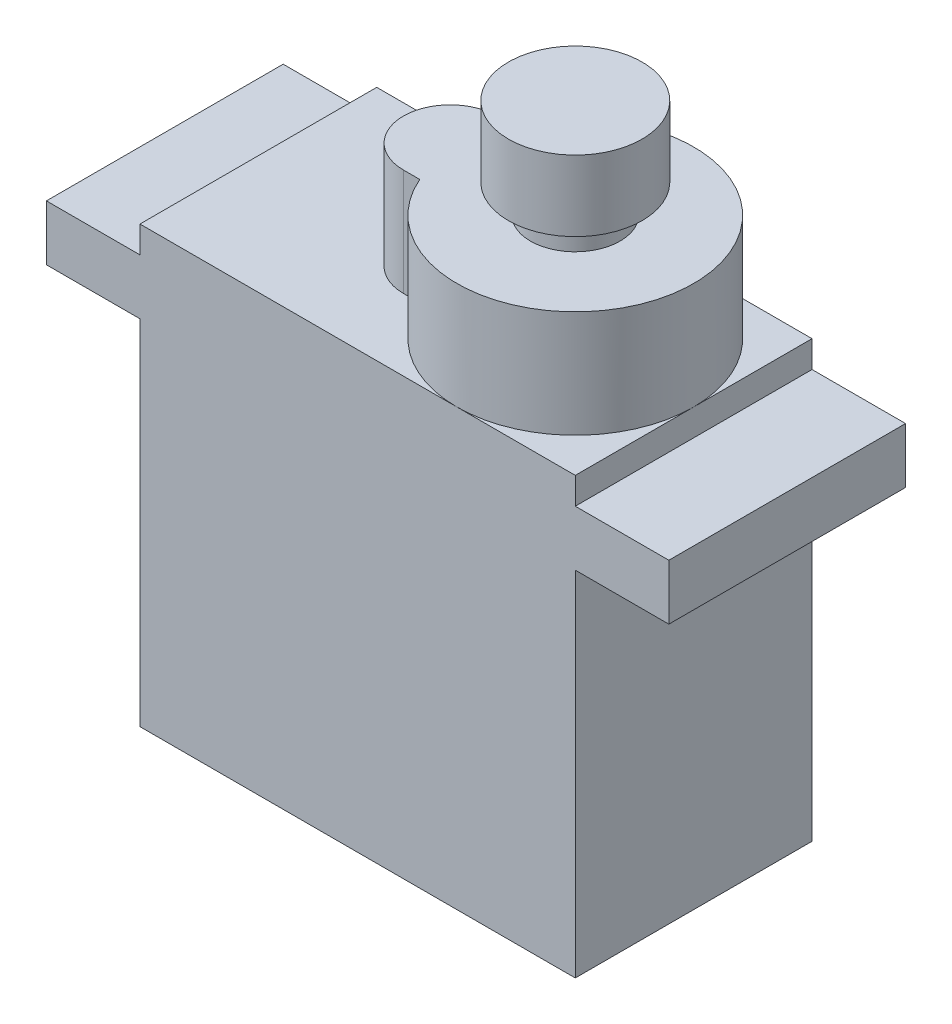
ISO-10303-21;
HEADER;
FILE_DESCRIPTION(('STEP AP214'),'2;1');
FILE_NAME('part.step','',(''),(''),'','','');
FILE_SCHEMA(('AUTOMOTIVE_DESIGN { 1 0 10303 214 1 1 1 1 }'));
ENDSEC;
DATA;
#1=APPLICATION_CONTEXT('core data for automotive mechanical design processes');
#2=APPLICATION_PROTOCOL_DEFINITION('international standard','automotive_design',2000,#1);
#3=PRODUCT_CONTEXT('',#1,'mechanical');
#4=PRODUCT('Part','Part','',(#3));
#5=PRODUCT_RELATED_PRODUCT_CATEGORY('part','',(#4));
#6=PRODUCT_DEFINITION_FORMATION('','',#4);
#7=PRODUCT_DEFINITION_CONTEXT('part definition',#1,'design');
#8=PRODUCT_DEFINITION('design','',#6,#7);
#9=PRODUCT_DEFINITION_SHAPE('','',#8);
#10=(LENGTH_UNIT() NAMED_UNIT(*) SI_UNIT(.MILLI.,.METRE.));
#11=(NAMED_UNIT(*) PLANE_ANGLE_UNIT() SI_UNIT($,.RADIAN.));
#12=(NAMED_UNIT(*) SI_UNIT($,.STERADIAN.) SOLID_ANGLE_UNIT());
#13=UNCERTAINTY_MEASURE_WITH_UNIT(LENGTH_MEASURE(1.E-05),#10,'distance_accuracy_value','');
#14=(GEOMETRIC_REPRESENTATION_CONTEXT(3) GLOBAL_UNCERTAINTY_ASSIGNED_CONTEXT((#13)) GLOBAL_UNIT_ASSIGNED_CONTEXT((#10,
#11,#12)) REPRESENTATION_CONTEXT('',''));
#15=CARTESIAN_POINT('',(0.,0.,0.));
#16=DIRECTION('',(0.,0.,1.));
#17=DIRECTION('',(1.,0.,0.));
#18=AXIS2_PLACEMENT_3D('',#15,#16,#17);
#19=CARTESIAN_POINT('',(5.2,22.2,6.2));
#20=DIRECTION('',(0.,-1.,0.));
#21=DIRECTION('',(0.,0.,-1.));
#22=AXIS2_PLACEMENT_3D('',#19,#20,#21);
#23=CYLINDRICAL_SURFACE('',#22,2.35);
#24=CARTESIAN_POINT('',(5.2,17.,6.2));
#25=DIRECTION('',(0.,1.,0.));
#26=DIRECTION('',(0.,0.,1.));
#27=AXIS2_PLACEMENT_3D('',#24,#25,#26);
#28=CIRCLE('',#27,2.35);
#29=CARTESIAN_POINT('',(5.2,17.,8.55));
#30=VERTEX_POINT('',#29);
#31=EDGE_CURVE('E569',#30,#30,#28,.T.);
#32=ORIENTED_EDGE('',*,*,#31,.T.);
#33=EDGE_LOOP('',(#32));
#34=FACE_BOUND('',#33,.T.);
#35=CARTESIAN_POINT('',(5.2,18.5,6.2));
#36=DIRECTION('',(0.,1.,0.));
#37=DIRECTION('',(0.,0.,1.));
#38=AXIS2_PLACEMENT_3D('',#35,#36,#37);
#39=CIRCLE('',#38,2.35);
#40=CARTESIAN_POINT('',(5.2,18.5,8.55));
#41=VERTEX_POINT('',#40);
#42=EDGE_CURVE('E11',#41,#41,#39,.T.);
#43=ORIENTED_EDGE('',*,*,#42,.F.);
#44=EDGE_LOOP('',(#43));
#45=FACE_BOUND('',#44,.T.);
#46=ADVANCED_FACE('F33',(#34,#45),#23,.T.);
#47=CARTESIAN_POINT('',(-11.4,11.4,12.4));
#48=DIRECTION('',(0.,-1.,0.));
#49=DIRECTION('',(0.,0.,-1.));
#50=AXIS2_PLACEMENT_3D('',#47,#48,#49);
#51=PLANE('',#50);
#52=CARTESIAN_POINT('',(5.2,11.4,6.2));
#53=DIRECTION('',(0.,1.,0.));
#54=DIRECTION('',(0.,0.,1.));
#55=AXIS2_PLACEMENT_3D('',#52,#53,#54);
#56=CIRCLE('',#55,6.2);
#57=CARTESIAN_POINT('',(11.4,11.4,6.2));
#58=VERTEX_POINT('',#57);
#59=CARTESIAN_POINT('',(5.2,11.4,0.));
#60=VERTEX_POINT('',#59);
#61=EDGE_CURVE('E41',#58,#60,#56,.T.);
#62=ORIENTED_EDGE('',*,*,#61,.F.);
#63=DIRECTION('',(0.,0.,-1.));
#64=VECTOR('',#63,1.);
#65=CARTESIAN_POINT('',(11.4,11.4,12.4));
#66=LINE('',#65,#64);
#67=CARTESIAN_POINT('',(11.4,11.4,0.));
#68=VERTEX_POINT('',#67);
#69=EDGE_CURVE('E256',#58,#68,#66,.T.);
#70=ORIENTED_EDGE('',*,*,#69,.T.);
#71=DIRECTION('',(-1.,0.,0.));
#72=VECTOR('',#71,1.);
#73=CARTESIAN_POINT('',(-11.4,11.4,0.));
#74=LINE('',#73,#72);
#75=EDGE_CURVE('E222',#68,#60,#74,.T.);
#76=ORIENTED_EDGE('',*,*,#75,.T.);
#77=EDGE_LOOP('',(#62,#70,#76));
#78=FACE_BOUND('',#77,.T.);
#79=ADVANCED_FACE('F288',(#78),#51,.F.);
#80=CARTESIAN_POINT('',(-0.495392874947259,11.4,3.75));
#81=VERTEX_POINT('',#80);
#82=EDGE_CURVE('E274',#60,#81,#56,.T.);
#83=ORIENTED_EDGE('',*,*,#82,.F.);
#84=CARTESIAN_POINT('',(-11.4,11.4,0.));
#85=VERTEX_POINT('',#84);
#86=EDGE_CURVE('E221',#60,#85,#74,.T.);
#87=ORIENTED_EDGE('',*,*,#86,.T.);
#88=DIRECTION('',(0.,0.,-1.));
#89=VECTOR('',#88,1.);
#90=CARTESIAN_POINT('',(-11.4,11.4,12.4));
#91=LINE('',#90,#89);
#92=CARTESIAN_POINT('',(-11.4,11.4,12.4));
#93=VERTEX_POINT('',#92);
#94=EDGE_CURVE('E253',#93,#85,#91,.T.);
#95=ORIENTED_EDGE('',*,*,#94,.F.);
#96=DIRECTION('',(-1.,0.,0.));
#97=VECTOR('',#96,1.);
#98=CARTESIAN_POINT('',(-11.4,11.4,12.4));
#99=LINE('',#98,#97);
#100=CARTESIAN_POINT('',(5.2,11.4,12.4));
#101=VERTEX_POINT('',#100);
#102=EDGE_CURVE('E196',#101,#93,#99,.T.);
#103=ORIENTED_EDGE('',*,*,#102,.F.);
#104=CARTESIAN_POINT('',(-0.49539287494726,11.4,8.65));
#105=VERTEX_POINT('',#104);
#106=EDGE_CURVE('E276',#105,#101,#56,.T.);
#107=ORIENTED_EDGE('',*,*,#106,.F.);
#108=DIRECTION('',(1.,0.,0.));
#109=VECTOR('',#108,1.);
#110=CARTESIAN_POINT('',(-1.35,11.4,8.65));
#111=LINE('',#110,#109);
#112=CARTESIAN_POINT('',(-1.35,11.4,8.65));
#113=VERTEX_POINT('',#112);
#114=EDGE_CURVE('E282',#113,#105,#111,.T.);
#115=ORIENTED_EDGE('',*,*,#114,.F.);
#116=CARTESIAN_POINT('',(-1.35,11.4,6.2));
#117=DIRECTION('',(0.,1.,0.));
#118=DIRECTION('',(0.,0.,1.));
#119=AXIS2_PLACEMENT_3D('',#116,#117,#118);
#120=CIRCLE('',#119,2.45);
#121=CARTESIAN_POINT('',(-1.35,11.4,3.75));
#122=VERTEX_POINT('',#121);
#123=EDGE_CURVE('E53',#122,#113,#120,.T.);
#124=ORIENTED_EDGE('',*,*,#123,.F.);
#125=DIRECTION('',(-1.,0.,0.));
#126=VECTOR('',#125,1.);
#127=CARTESIAN_POINT('',(-1.35,11.4,3.75));
#128=LINE('',#127,#126);
#129=EDGE_CURVE('E48',#81,#122,#128,.T.);
#130=ORIENTED_EDGE('',*,*,#129,.F.);
#131=EDGE_LOOP('',(#83,#87,#95,#103,#107,#115,#124,#130));
#132=FACE_BOUND('',#131,.T.);
#133=ADVANCED_FACE('F313',(#132),#51,.F.);
#134=EDGE_CURVE('E270',#101,#58,#56,.T.);
#135=ORIENTED_EDGE('',*,*,#134,.F.);
#136=CARTESIAN_POINT('',(11.4,11.4,12.4));
#137=VERTEX_POINT('',#136);
#138=EDGE_CURVE('E197',#137,#101,#99,.T.);
#139=ORIENTED_EDGE('',*,*,#138,.F.);
#140=EDGE_CURVE('E257',#137,#58,#66,.T.);
#141=ORIENTED_EDGE('',*,*,#140,.T.);
#142=EDGE_LOOP('',(#135,#139,#141));
#143=FACE_BOUND('',#142,.T.);
#144=ADVANCED_FACE('F297',(#143),#51,.F.);
#145=CARTESIAN_POINT('',(11.4,7.1,12.4));
#146=DIRECTION('',(-1.,0.,0.));
#147=DIRECTION('',(0.,-1.,0.));
#148=AXIS2_PLACEMENT_3D('',#145,#146,#147);
#149=PLANE('',#148);
#150=DIRECTION('',(0.,1.,0.));
#151=VECTOR('',#150,1.);
#152=CARTESIAN_POINT('',(11.4,7.1,0.));
#153=LINE('',#152,#151);
#154=CARTESIAN_POINT('',(11.4,-11.4,0.));
#155=VERTEX_POINT('',#154);
#156=CARTESIAN_POINT('',(11.4,7.1,0.));
#157=VERTEX_POINT('',#156);
#158=EDGE_CURVE('E175',#155,#157,#153,.T.);
#159=ORIENTED_EDGE('',*,*,#158,.T.);
#160=DIRECTION('',(0.,0.,-1.));
#161=VECTOR('',#160,1.);
#162=CARTESIAN_POINT('',(11.4,7.1,12.4));
#163=LINE('',#162,#161);
#164=CARTESIAN_POINT('',(11.4,7.1,12.4));
#165=VERTEX_POINT('',#164);
#166=EDGE_CURVE('E268',#165,#157,#163,.T.);
#167=ORIENTED_EDGE('',*,*,#166,.F.);
#168=DIRECTION('',(0.,1.,0.));
#169=VECTOR('',#168,1.);
#170=CARTESIAN_POINT('',(11.4,7.1,12.4));
#171=LINE('',#170,#169);
#172=CARTESIAN_POINT('',(11.4,-11.4,12.4));
#173=VERTEX_POINT('',#172);
#174=EDGE_CURVE('E184',#173,#165,#171,.T.);
#175=ORIENTED_EDGE('',*,*,#174,.F.);
#176=DIRECTION('',(0.,0.,-1.));
#177=VECTOR('',#176,1.);
#178=CARTESIAN_POINT('',(11.4,-11.4,12.4));
#179=LINE('',#178,#177);
#180=EDGE_CURVE('E211',#173,#155,#179,.T.);
#181=ORIENTED_EDGE('',*,*,#180,.T.);
#182=EDGE_LOOP('',(#159,#167,#175,#181));
#183=FACE_BOUND('',#182,.T.);
#184=ADVANCED_FACE('F35',(#183),#149,.F.);
#185=CARTESIAN_POINT('',(16.3,7.1,12.4));
#186=DIRECTION('',(0.,1.,0.));
#187=DIRECTION('',(-1.,0.,0.));
#188=AXIS2_PLACEMENT_3D('',#185,#186,#187);
#189=PLANE('',#188);
#190=DIRECTION('',(1.,0.,0.));
#191=VECTOR('',#190,1.);
#192=CARTESIAN_POINT('',(16.3,7.1,0.));
#193=LINE('',#192,#191);
#194=CARTESIAN_POINT('',(16.3,7.1,0.));
#195=VERTEX_POINT('',#194);
#196=EDGE_CURVE('E178',#157,#195,#193,.T.);
#197=ORIENTED_EDGE('',*,*,#196,.T.);
#198=DIRECTION('',(0.,0.,-1.));
#199=VECTOR('',#198,1.);
#200=CARTESIAN_POINT('',(16.3,7.1,12.4));
#201=LINE('',#200,#199);
#202=CARTESIAN_POINT('',(16.3,7.1,12.4));
#203=VERTEX_POINT('',#202);
#204=EDGE_CURVE('E266',#203,#195,#201,.T.);
#205=ORIENTED_EDGE('',*,*,#204,.F.);
#206=DIRECTION('',(1.,0.,0.));
#207=VECTOR('',#206,1.);
#208=CARTESIAN_POINT('',(16.3,7.1,12.4));
#209=LINE('',#208,#207);
#210=EDGE_CURVE('E187',#165,#203,#209,.T.);
#211=ORIENTED_EDGE('',*,*,#210,.F.);
#212=ORIENTED_EDGE('',*,*,#166,.T.);
#213=EDGE_LOOP('',(#197,#205,#211,#212));
#214=FACE_BOUND('',#213,.T.);
#215=ADVANCED_FACE('F347',(#214),#189,.F.);
#216=CARTESIAN_POINT('',(16.3,10.,12.4));
#217=DIRECTION('',(-1.,0.,0.));
#218=DIRECTION('',(0.,0.,1.));
#219=AXIS2_PLACEMENT_3D('',#216,#217,#218);
#220=PLANE('',#219);
#221=DIRECTION('',(0.,1.,0.));
#222=VECTOR('',#221,1.);
#223=CARTESIAN_POINT('',(16.3,10.,0.));
#224=LINE('',#223,#222);
#225=CARTESIAN_POINT('',(16.3,10.,0.));
#226=VERTEX_POINT('',#225);
#227=EDGE_CURVE('E214',#195,#226,#224,.T.);
#228=ORIENTED_EDGE('',*,*,#227,.T.);
#229=DIRECTION('',(0.,0.,-1.));
#230=VECTOR('',#229,1.);
#231=CARTESIAN_POINT('',(16.3,10.,12.4));
#232=LINE('',#231,#230);
#233=CARTESIAN_POINT('',(16.3,10.,12.4));
#234=VERTEX_POINT('',#233);
#235=EDGE_CURVE('E263',#234,#226,#232,.T.);
#236=ORIENTED_EDGE('',*,*,#235,.F.);
#237=DIRECTION('',(0.,1.,0.));
#238=VECTOR('',#237,1.);
#239=CARTESIAN_POINT('',(16.3,10.,12.4));
#240=LINE('',#239,#238);
#241=EDGE_CURVE('E190',#203,#234,#240,.T.);
#242=ORIENTED_EDGE('',*,*,#241,.F.);
#243=ORIENTED_EDGE('',*,*,#204,.T.);
#244=EDGE_LOOP('',(#228,#236,#242,#243));
#245=FACE_BOUND('',#244,.T.);
#246=ADVANCED_FACE('F349',(#245),#220,.F.);
#247=CARTESIAN_POINT('',(11.4,10.,12.4));
#248=DIRECTION('',(0.,-1.,0.));
#249=DIRECTION('',(0.,0.,-1.));
#250=AXIS2_PLACEMENT_3D('',#247,#248,#249);
#251=PLANE('',#250);
#252=DIRECTION('',(-1.,0.,0.));
#253=VECTOR('',#252,1.);
#254=CARTESIAN_POINT('',(11.4,10.,0.));
#255=LINE('',#254,#253);
#256=CARTESIAN_POINT('',(11.4,10.,0.));
#257=VERTEX_POINT('',#256);
#258=EDGE_CURVE('E216',#226,#257,#255,.T.);
#259=ORIENTED_EDGE('',*,*,#258,.T.);
#260=DIRECTION('',(0.,0.,-1.));
#261=VECTOR('',#260,1.);
#262=CARTESIAN_POINT('',(11.4,10.,12.4));
#263=LINE('',#262,#261);
#264=CARTESIAN_POINT('',(11.4,10.,12.4));
#265=VERTEX_POINT('',#264);
#266=EDGE_CURVE('E260',#265,#257,#263,.T.);
#267=ORIENTED_EDGE('',*,*,#266,.F.);
#268=DIRECTION('',(-1.,0.,0.));
#269=VECTOR('',#268,1.);
#270=CARTESIAN_POINT('',(11.4,10.,12.4));
#271=LINE('',#270,#269);
#272=EDGE_CURVE('E192',#234,#265,#271,.T.);
#273=ORIENTED_EDGE('',*,*,#272,.F.);
#274=ORIENTED_EDGE('',*,*,#235,.T.);
#275=EDGE_LOOP('',(#259,#267,#273,#274));
#276=FACE_BOUND('',#275,.T.);
#277=ADVANCED_FACE('F350',(#276),#251,.F.);
#278=CARTESIAN_POINT('',(11.4,11.4,12.4));
#279=DIRECTION('',(-1.,0.,0.));
#280=DIRECTION('',(0.,-1.,0.));
#281=AXIS2_PLACEMENT_3D('',#278,#279,#280);
#282=PLANE('',#281);
#283=DIRECTION('',(0.,1.,0.));
#284=VECTOR('',#283,1.);
#285=CARTESIAN_POINT('',(11.4,11.4,0.));
#286=LINE('',#285,#284);
#287=EDGE_CURVE('E218',#257,#68,#286,.T.);
#288=ORIENTED_EDGE('',*,*,#287,.T.);
#289=ORIENTED_EDGE('',*,*,#69,.F.);
#290=ORIENTED_EDGE('',*,*,#140,.F.);
#291=DIRECTION('',(0.,1.,0.));
#292=VECTOR('',#291,1.);
#293=CARTESIAN_POINT('',(11.4,11.4,12.4));
#294=LINE('',#293,#292);
#295=EDGE_CURVE('E194',#265,#137,#294,.T.);
#296=ORIENTED_EDGE('',*,*,#295,.F.);
#297=ORIENTED_EDGE('',*,*,#266,.T.);
#298=EDGE_LOOP('',(#288,#289,#290,#296,#297));
#299=FACE_BOUND('',#298,.T.);
#300=ADVANCED_FACE('F292',(#299),#282,.F.);
#301=CARTESIAN_POINT('',(-11.4,11.4,12.4));
#302=DIRECTION('',(1.,0.,0.));
#303=DIRECTION('',(0.,1.,0.));
#304=AXIS2_PLACEMENT_3D('',#301,#302,#303);
#305=PLANE('',#304);
#306=DIRECTION('',(0.,-1.,0.));
#307=VECTOR('',#306,1.);
#308=CARTESIAN_POINT('',(-11.4,11.4,0.));
#309=LINE('',#308,#307);
#310=CARTESIAN_POINT('',(-11.4,10.,0.));
#311=VERTEX_POINT('',#310);
#312=EDGE_CURVE('E225',#85,#311,#309,.T.);
#313=ORIENTED_EDGE('',*,*,#312,.T.);
#314=DIRECTION('',(0.,0.,-1.));
#315=VECTOR('',#314,1.);
#316=CARTESIAN_POINT('',(-11.4,10.,12.4));
#317=LINE('',#316,#315);
#318=CARTESIAN_POINT('',(-11.4,10.,12.4));
#319=VERTEX_POINT('',#318);
#320=EDGE_CURVE('E250',#319,#311,#317,.T.);
#321=ORIENTED_EDGE('',*,*,#320,.F.);
#322=DIRECTION('',(0.,-1.,0.));
#323=VECTOR('',#322,1.);
#324=CARTESIAN_POINT('',(-11.4,11.4,12.4));
#325=LINE('',#324,#323);
#326=EDGE_CURVE('E200',#93,#319,#325,.T.);
#327=ORIENTED_EDGE('',*,*,#326,.F.);
#328=ORIENTED_EDGE('',*,*,#94,.T.);
#329=EDGE_LOOP('',(#313,#321,#327,#328));
#330=FACE_BOUND('',#329,.T.);
#331=ADVANCED_FACE('F316',(#330),#305,.F.);
#332=CARTESIAN_POINT('',(-11.4,10.,12.4));
#333=DIRECTION('',(0.,-1.,0.));
#334=DIRECTION('',(0.,0.,-1.));
#335=AXIS2_PLACEMENT_3D('',#332,#333,#334);
#336=PLANE('',#335);
#337=DIRECTION('',(-1.,0.,0.));
#338=VECTOR('',#337,1.);
#339=CARTESIAN_POINT('',(-11.4,10.,0.));
#340=LINE('',#339,#338);
#341=CARTESIAN_POINT('',(-16.3,10.,0.));
#342=VERTEX_POINT('',#341);
#343=EDGE_CURVE('E227',#311,#342,#340,.T.);
#344=ORIENTED_EDGE('',*,*,#343,.T.);
#345=DIRECTION('',(0.,0.,-1.));
#346=VECTOR('',#345,1.);
#347=CARTESIAN_POINT('',(-16.3,10.,12.4));
#348=LINE('',#347,#346);
#349=CARTESIAN_POINT('',(-16.3,10.,12.4));
#350=VERTEX_POINT('',#349);
#351=EDGE_CURVE('E247',#350,#342,#348,.T.);
#352=ORIENTED_EDGE('',*,*,#351,.F.);
#353=DIRECTION('',(-1.,0.,0.));
#354=VECTOR('',#353,1.);
#355=CARTESIAN_POINT('',(-11.4,10.,12.4));
#356=LINE('',#355,#354);
#357=EDGE_CURVE('E202',#319,#350,#356,.T.);
#358=ORIENTED_EDGE('',*,*,#357,.F.);
#359=ORIENTED_EDGE('',*,*,#320,.T.);
#360=EDGE_LOOP('',(#344,#352,#358,#359));
#361=FACE_BOUND('',#360,.T.);
#362=ADVANCED_FACE('F323',(#361),#336,.F.);
#363=CARTESIAN_POINT('',(-16.3,10.,12.4));
#364=DIRECTION('',(1.,0.,0.));
#365=DIRECTION('',(0.,0.,-1.));
#366=AXIS2_PLACEMENT_3D('',#363,#364,#365);
#367=PLANE('',#366);
#368=DIRECTION('',(0.,-1.,0.));
#369=VECTOR('',#368,1.);
#370=CARTESIAN_POINT('',(-16.3,10.,0.));
#371=LINE('',#370,#369);
#372=CARTESIAN_POINT('',(-16.3,7.1,0.));
#373=VERTEX_POINT('',#372);
#374=EDGE_CURVE('E229',#342,#373,#371,.T.);
#375=ORIENTED_EDGE('',*,*,#374,.T.);
#376=DIRECTION('',(0.,0.,-1.));
#377=VECTOR('',#376,1.);
#378=CARTESIAN_POINT('',(-16.3,7.1,12.4));
#379=LINE('',#378,#377);
#380=CARTESIAN_POINT('',(-16.3,7.1,12.4));
#381=VERTEX_POINT('',#380);
#382=EDGE_CURVE('E244',#381,#373,#379,.T.);
#383=ORIENTED_EDGE('',*,*,#382,.F.);
#384=DIRECTION('',(0.,-1.,0.));
#385=VECTOR('',#384,1.);
#386=CARTESIAN_POINT('',(-16.3,10.,12.4));
#387=LINE('',#386,#385);
#388=EDGE_CURVE('E204',#350,#381,#387,.T.);
#389=ORIENTED_EDGE('',*,*,#388,.F.);
#390=ORIENTED_EDGE('',*,*,#351,.T.);
#391=EDGE_LOOP('',(#375,#383,#389,#390));
#392=FACE_BOUND('',#391,.T.);
#393=ADVANCED_FACE('F326',(#392),#367,.F.);
#394=CARTESIAN_POINT('',(-16.3,7.1,12.4));
#395=DIRECTION('',(0.,1.,0.));
#396=DIRECTION('',(0.,0.,1.));
#397=AXIS2_PLACEMENT_3D('',#394,#395,#396);
#398=PLANE('',#397);
#399=DIRECTION('',(1.,0.,0.));
#400=VECTOR('',#399,1.);
#401=CARTESIAN_POINT('',(-16.3,7.1,0.));
#402=LINE('',#401,#400);
#403=CARTESIAN_POINT('',(-11.4,7.1,0.));
#404=VERTEX_POINT('',#403);
#405=EDGE_CURVE('E231',#373,#404,#402,.T.);
#406=ORIENTED_EDGE('',*,*,#405,.T.);
#407=DIRECTION('',(0.,0.,-1.));
#408=VECTOR('',#407,1.);
#409=CARTESIAN_POINT('',(-11.4,7.1,12.4));
#410=LINE('',#409,#408);
#411=CARTESIAN_POINT('',(-11.4,7.1,12.4));
#412=VERTEX_POINT('',#411);
#413=EDGE_CURVE('E241',#412,#404,#410,.T.);
#414=ORIENTED_EDGE('',*,*,#413,.F.);
#415=DIRECTION('',(1.,0.,0.));
#416=VECTOR('',#415,1.);
#417=CARTESIAN_POINT('',(-16.3,7.1,12.4));
#418=LINE('',#417,#416);
#419=EDGE_CURVE('E206',#381,#412,#418,.T.);
#420=ORIENTED_EDGE('',*,*,#419,.F.);
#421=ORIENTED_EDGE('',*,*,#382,.T.);
#422=EDGE_LOOP('',(#406,#414,#420,#421));
#423=FACE_BOUND('',#422,.T.);
#424=ADVANCED_FACE('F331',(#423),#398,.F.);
#425=CARTESIAN_POINT('',(-11.4,7.1,12.4));
#426=DIRECTION('',(1.,0.,0.));
#427=DIRECTION('',(0.,1.,0.));
#428=AXIS2_PLACEMENT_3D('',#425,#426,#427);
#429=PLANE('',#428);
#430=DIRECTION('',(0.,-1.,0.));
#431=VECTOR('',#430,1.);
#432=CARTESIAN_POINT('',(-11.4,7.1,0.));
#433=LINE('',#432,#431);
#434=CARTESIAN_POINT('',(-11.4,-11.4,0.));
#435=VERTEX_POINT('',#434);
#436=EDGE_CURVE('E233',#404,#435,#433,.T.);
#437=ORIENTED_EDGE('',*,*,#436,.T.);
#438=DIRECTION('',(0.,0.,-1.));
#439=VECTOR('',#438,1.);
#440=CARTESIAN_POINT('',(-11.4,-11.4,12.4));
#441=LINE('',#440,#439);
#442=CARTESIAN_POINT('',(-11.4,-11.4,12.4));
#443=VERTEX_POINT('',#442);
#444=EDGE_CURVE('E238',#443,#435,#441,.T.);
#445=ORIENTED_EDGE('',*,*,#444,.F.);
#446=DIRECTION('',(0.,-1.,0.));
#447=VECTOR('',#446,1.);
#448=CARTESIAN_POINT('',(-11.4,7.1,12.4));
#449=LINE('',#448,#447);
#450=EDGE_CURVE('E208',#412,#443,#449,.T.);
#451=ORIENTED_EDGE('',*,*,#450,.F.);
#452=ORIENTED_EDGE('',*,*,#413,.T.);
#453=EDGE_LOOP('',(#437,#445,#451,#452));
#454=FACE_BOUND('',#453,.T.);
#455=ADVANCED_FACE('F337',(#454),#429,.F.);
#456=CARTESIAN_POINT('',(-11.4,-11.4,12.4));
#457=DIRECTION('',(0.,1.,0.));
#458=DIRECTION('',(0.,0.,1.));
#459=AXIS2_PLACEMENT_3D('',#456,#457,#458);
#460=PLANE('',#459);
#461=DIRECTION('',(1.,0.,0.));
#462=VECTOR('',#461,1.);
#463=CARTESIAN_POINT('',(-11.4,-11.4,0.));
#464=LINE('',#463,#462);
#465=EDGE_CURVE('E188',#435,#155,#464,.T.);
#466=ORIENTED_EDGE('',*,*,#465,.T.);
#467=ORIENTED_EDGE('',*,*,#180,.F.);
#468=DIRECTION('',(1.,0.,0.));
#469=VECTOR('',#468,1.);
#470=CARTESIAN_POINT('',(-11.4,-11.4,12.4));
#471=LINE('',#470,#469);
#472=EDGE_CURVE('E210',#443,#173,#471,.T.);
#473=ORIENTED_EDGE('',*,*,#472,.F.);
#474=ORIENTED_EDGE('',*,*,#444,.T.);
#475=EDGE_LOOP('',(#466,#467,#473,#474));
#476=FACE_BOUND('',#475,.T.);
#477=ADVANCED_FACE('F341',(#476),#460,.F.);
#478=CARTESIAN_POINT('',(0.,0.,12.4));
#479=DIRECTION('',(0.,0.,1.));
#480=DIRECTION('',(1.,0.,0.));
#481=AXIS2_PLACEMENT_3D('',#478,#479,#480);
#482=PLANE('',#481);
#483=ORIENTED_EDGE('',*,*,#174,.T.);
#484=ORIENTED_EDGE('',*,*,#210,.T.);
#485=ORIENTED_EDGE('',*,*,#241,.T.);
#486=ORIENTED_EDGE('',*,*,#272,.T.);
#487=ORIENTED_EDGE('',*,*,#295,.T.);
#488=ORIENTED_EDGE('',*,*,#138,.T.);
#489=ORIENTED_EDGE('',*,*,#102,.T.);
#490=ORIENTED_EDGE('',*,*,#326,.T.);
#491=ORIENTED_EDGE('',*,*,#357,.T.);
#492=ORIENTED_EDGE('',*,*,#388,.T.);
#493=ORIENTED_EDGE('',*,*,#419,.T.);
#494=ORIENTED_EDGE('',*,*,#450,.T.);
#495=ORIENTED_EDGE('',*,*,#472,.T.);
#496=EDGE_LOOP('',(#483,#484,#485,#486,#487,#488,#489,#490,#491,#492,#493,#494,#495));
#497=FACE_BOUND('',#496,.T.);
#498=ADVANCED_FACE('F300',(#497),#482,.T.);
#499=CARTESIAN_POINT('',(0.,0.,0.));
#500=DIRECTION('',(0.,0.,1.));
#501=DIRECTION('',(1.,0.,0.));
#502=AXIS2_PLACEMENT_3D('',#499,#500,#501);
#503=PLANE('',#502);
#504=ORIENTED_EDGE('',*,*,#158,.F.);
#505=ORIENTED_EDGE('',*,*,#465,.F.);
#506=ORIENTED_EDGE('',*,*,#436,.F.);
#507=ORIENTED_EDGE('',*,*,#405,.F.);
#508=ORIENTED_EDGE('',*,*,#374,.F.);
#509=ORIENTED_EDGE('',*,*,#343,.F.);
#510=ORIENTED_EDGE('',*,*,#312,.F.);
#511=ORIENTED_EDGE('',*,*,#86,.F.);
#512=ORIENTED_EDGE('',*,*,#75,.F.);
#513=ORIENTED_EDGE('',*,*,#287,.F.);
#514=ORIENTED_EDGE('',*,*,#258,.F.);
#515=ORIENTED_EDGE('',*,*,#227,.F.);
#516=ORIENTED_EDGE('',*,*,#196,.F.);
#517=EDGE_LOOP('',(#504,#505,#506,#507,#508,#509,#510,#511,#512,#513,#514,#515,#516));
#518=FACE_BOUND('',#517,.T.);
#519=ADVANCED_FACE('F308',(#518),#503,.F.);
#520=CARTESIAN_POINT('',(-1.35,17.,6.2));
#521=DIRECTION('',(0.,-1.,0.));
#522=DIRECTION('',(0.,0.,-1.));
#523=AXIS2_PLACEMENT_3D('',#520,#521,#522);
#524=CYLINDRICAL_SURFACE('',#523,2.45);
#525=ORIENTED_EDGE('',*,*,#123,.T.);
#526=DIRECTION('',(0.,-1.,0.));
#527=VECTOR('',#526,1.);
#528=CARTESIAN_POINT('',(-1.35,17.,8.65));
#529=LINE('',#528,#527);
#530=CARTESIAN_POINT('',(-1.35,17.,8.65));
#531=VERTEX_POINT('',#530);
#532=EDGE_CURVE('E158',#531,#113,#529,.T.);
#533=ORIENTED_EDGE('',*,*,#532,.F.);
#534=CARTESIAN_POINT('',(-1.35,17.,6.2));
#535=DIRECTION('',(0.,1.,0.));
#536=DIRECTION('',(0.,0.,1.));
#537=AXIS2_PLACEMENT_3D('',#534,#535,#536);
#538=CIRCLE('',#537,2.45);
#539=CARTESIAN_POINT('',(-1.35,17.,3.75));
#540=VERTEX_POINT('',#539);
#541=EDGE_CURVE('E164',#540,#531,#538,.T.);
#542=ORIENTED_EDGE('',*,*,#541,.F.);
#543=DIRECTION('',(0.,-1.,0.));
#544=VECTOR('',#543,1.);
#545=CARTESIAN_POINT('',(-1.35,17.,3.75));
#546=LINE('',#545,#544);
#547=EDGE_CURVE('E575',#540,#122,#546,.T.);
#548=ORIENTED_EDGE('',*,*,#547,.T.);
#549=EDGE_LOOP('',(#525,#533,#542,#548));
#550=FACE_BOUND('',#549,.T.);
#551=ADVANCED_FACE('F174',(#550),#524,.T.);
#552=CARTESIAN_POINT('',(-1.35,17.,8.65));
#553=DIRECTION('',(0.,0.,-1.));
#554=DIRECTION('',(-1.,0.,0.));
#555=AXIS2_PLACEMENT_3D('',#552,#553,#554);
#556=PLANE('',#555);
#557=ORIENTED_EDGE('',*,*,#114,.T.);
#558=DIRECTION('',(0.,-1.,0.));
#559=VECTOR('',#558,1.);
#560=CARTESIAN_POINT('',(-0.49539287494726,17.,8.65));
#561=LINE('',#560,#559);
#562=CARTESIAN_POINT('',(-0.49539287494726,17.,8.65));
#563=VERTEX_POINT('',#562);
#564=EDGE_CURVE('E160',#563,#105,#561,.T.);
#565=ORIENTED_EDGE('',*,*,#564,.F.);
#566=DIRECTION('',(1.,0.,0.));
#567=VECTOR('',#566,1.);
#568=CARTESIAN_POINT('',(-1.35,17.,8.65));
#569=LINE('',#568,#567);
#570=EDGE_CURVE('E153',#531,#563,#569,.T.);
#571=ORIENTED_EDGE('',*,*,#570,.F.);
#572=ORIENTED_EDGE('',*,*,#532,.T.);
#573=EDGE_LOOP('',(#557,#565,#571,#572));
#574=FACE_BOUND('',#573,.T.);
#575=ADVANCED_FACE('F156',(#574),#556,.F.);
#576=CARTESIAN_POINT('',(5.2,17.,6.2));
#577=DIRECTION('',(0.,-1.,0.));
#578=DIRECTION('',(0.,0.,-1.));
#579=AXIS2_PLACEMENT_3D('',#576,#577,#578);
#580=CYLINDRICAL_SURFACE('',#579,6.2);
#581=ORIENTED_EDGE('',*,*,#106,.T.);
#582=ORIENTED_EDGE('',*,*,#134,.T.);
#583=ORIENTED_EDGE('',*,*,#61,.T.);
#584=ORIENTED_EDGE('',*,*,#82,.T.);
#585=DIRECTION('',(0.,-1.,0.));
#586=VECTOR('',#585,1.);
#587=CARTESIAN_POINT('',(-0.495392874947259,17.,3.75));
#588=LINE('',#587,#586);
#589=CARTESIAN_POINT('',(-0.495392874947259,17.,3.75));
#590=VERTEX_POINT('',#589);
#591=EDGE_CURVE('E180',#590,#81,#588,.T.);
#592=ORIENTED_EDGE('',*,*,#591,.F.);
#593=CARTESIAN_POINT('',(5.2,17.,6.2));
#594=DIRECTION('',(0.,1.,0.));
#595=DIRECTION('',(0.,0.,1.));
#596=AXIS2_PLACEMENT_3D('',#593,#594,#595);
#597=CIRCLE('',#596,6.2);
#598=EDGE_CURVE('E163',#563,#590,#597,.T.);
#599=ORIENTED_EDGE('',*,*,#598,.F.);
#600=ORIENTED_EDGE('',*,*,#564,.T.);
#601=EDGE_LOOP('',(#581,#582,#583,#584,#592,#599,#600));
#602=FACE_BOUND('',#601,.T.);
#603=ADVANCED_FACE('F283',(#602),#580,.T.);
#604=CARTESIAN_POINT('',(-1.35,17.,3.75));
#605=DIRECTION('',(0.,0.,1.));
#606=DIRECTION('',(1.,0.,0.));
#607=AXIS2_PLACEMENT_3D('',#604,#605,#606);
#608=PLANE('',#607);
#609=ORIENTED_EDGE('',*,*,#129,.T.);
#610=ORIENTED_EDGE('',*,*,#547,.F.);
#611=DIRECTION('',(-1.,0.,0.));
#612=VECTOR('',#611,1.);
#613=CARTESIAN_POINT('',(-1.35,17.,3.75));
#614=LINE('',#613,#612);
#615=EDGE_CURVE('E169',#590,#540,#614,.T.);
#616=ORIENTED_EDGE('',*,*,#615,.F.);
#617=ORIENTED_EDGE('',*,*,#591,.T.);
#618=EDGE_LOOP('',(#609,#610,#616,#617));
#619=FACE_BOUND('',#618,.T.);
#620=ADVANCED_FACE('F375',(#619),#608,.F.);
#621=CARTESIAN_POINT('',(-1.35,17.,6.2));
#622=DIRECTION('',(0.,1.,0.));
#623=DIRECTION('',(0.,0.,1.));
#624=AXIS2_PLACEMENT_3D('',#621,#622,#623);
#625=PLANE('',#624);
#626=ORIENTED_EDGE('',*,*,#31,.F.);
#627=EDGE_LOOP('',(#626));
#628=FACE_BOUND('',#627,.T.);
#629=ORIENTED_EDGE('',*,*,#541,.T.);
#630=ORIENTED_EDGE('',*,*,#570,.T.);
#631=ORIENTED_EDGE('',*,*,#598,.T.);
#632=ORIENTED_EDGE('',*,*,#615,.T.);
#633=EDGE_LOOP('',(#629,#630,#631,#632));
#634=FACE_BOUND('',#633,.T.);
#635=ADVANCED_FACE('F167',(#628,#634),#625,.T.);
#636=CARTESIAN_POINT('',(5.2,18.5,6.2));
#637=DIRECTION('',(0.,1.,0.));
#638=DIRECTION('',(0.,0.,1.));
#639=AXIS2_PLACEMENT_3D('',#636,#637,#638);
#640=CYLINDRICAL_SURFACE('',#639,3.5);
#641=CARTESIAN_POINT('',(5.2,18.5,6.2));
#642=DIRECTION('',(0.,1.,0.));
#643=DIRECTION('',(0.,0.,1.));
#644=AXIS2_PLACEMENT_3D('',#641,#642,#643);
#645=CIRCLE('',#644,3.5);
#646=CARTESIAN_POINT('',(5.2,18.5,9.7));
#647=VERTEX_POINT('',#646);
#648=EDGE_CURVE('E566',#647,#647,#645,.T.);
#649=ORIENTED_EDGE('',*,*,#648,.T.);
#650=EDGE_LOOP('',(#649));
#651=FACE_BOUND('',#650,.T.);
#652=CARTESIAN_POINT('',(5.2,22.2,6.2));
#653=DIRECTION('',(0.,1.,0.));
#654=DIRECTION('',(0.,0.,1.));
#655=AXIS2_PLACEMENT_3D('',#652,#653,#654);
#656=CIRCLE('',#655,3.5);
#657=CARTESIAN_POINT('',(5.2,22.2,9.7));
#658=VERTEX_POINT('',#657);
#659=EDGE_CURVE('E564',#658,#658,#656,.T.);
#660=ORIENTED_EDGE('',*,*,#659,.F.);
#661=EDGE_LOOP('',(#660));
#662=FACE_BOUND('',#661,.T.);
#663=ADVANCED_FACE('F374',(#651,#662),#640,.T.);
#664=CARTESIAN_POINT('',(5.2,18.5,6.2));
#665=DIRECTION('',(0.,1.,0.));
#666=DIRECTION('',(0.,0.,1.));
#667=AXIS2_PLACEMENT_3D('',#664,#665,#666);
#668=PLANE('',#667);
#669=ORIENTED_EDGE('',*,*,#42,.T.);
#670=EDGE_LOOP('',(#669));
#671=FACE_BOUND('',#670,.T.);
#672=ORIENTED_EDGE('',*,*,#648,.F.);
#673=EDGE_LOOP('',(#672));
#674=FACE_BOUND('',#673,.T.);
#675=ADVANCED_FACE('F460',(#671,#674),#668,.F.);
#676=CARTESIAN_POINT('',(5.2,22.2,6.2));
#677=DIRECTION('',(0.,1.,0.));
#678=DIRECTION('',(0.,0.,1.));
#679=AXIS2_PLACEMENT_3D('',#676,#677,#678);
#680=PLANE('',#679);
#681=ORIENTED_EDGE('',*,*,#659,.T.);
#682=EDGE_LOOP('',(#681));
#683=FACE_BOUND('',#682,.T.);
#684=ADVANCED_FACE('F370',(#683),#680,.T.);
#685=CLOSED_SHELL('',(#46,#79,#133,#144,#184,#215,#246,#277,#300,#331,#362,#393,#424,#455,#477,
#498,#519,#551,#575,#603,#620,#635,#663,#675,#684));
#686=MANIFOLD_SOLID_BREP('B2',#685);
#687=ADVANCED_BREP_SHAPE_REPRESENTATION('',(#18,#686),#14);
#688=SHAPE_DEFINITION_REPRESENTATION(#9,#687);
ENDSEC;
END-ISO-10303-21;
